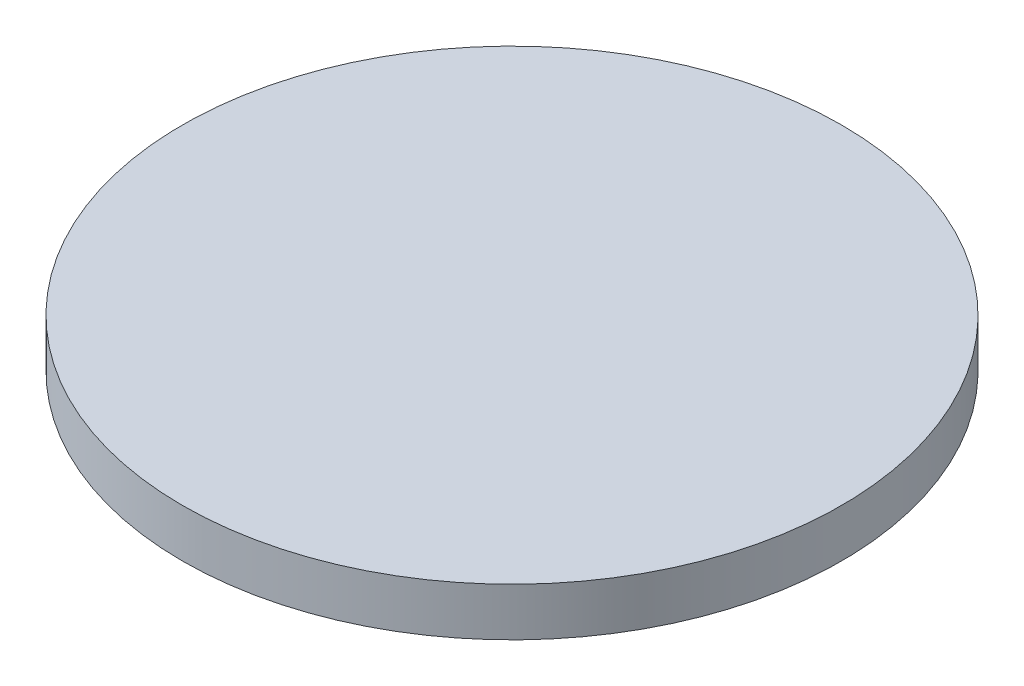
ISO-10303-21;
HEADER;
FILE_DESCRIPTION(('STEP AP214'),'2;1');
FILE_NAME('part.step','',(''),(''),'','','');
FILE_SCHEMA(('AUTOMOTIVE_DESIGN { 1 0 10303 214 1 1 1 1 }'));
ENDSEC;
DATA;
#1=APPLICATION_CONTEXT('core data for automotive mechanical design processes');
#2=APPLICATION_PROTOCOL_DEFINITION('international standard','automotive_design',2000,#1);
#3=PRODUCT_CONTEXT('',#1,'mechanical');
#4=PRODUCT('Part','Part','',(#3));
#5=PRODUCT_RELATED_PRODUCT_CATEGORY('part','',(#4));
#6=PRODUCT_DEFINITION_FORMATION('','',#4);
#7=PRODUCT_DEFINITION_CONTEXT('part definition',#1,'design');
#8=PRODUCT_DEFINITION('design','',#6,#7);
#9=PRODUCT_DEFINITION_SHAPE('','',#8);
#10=(LENGTH_UNIT() NAMED_UNIT(*) SI_UNIT(.MILLI.,.METRE.));
#11=(NAMED_UNIT(*) PLANE_ANGLE_UNIT() SI_UNIT($,.RADIAN.));
#12=(NAMED_UNIT(*) SI_UNIT($,.STERADIAN.) SOLID_ANGLE_UNIT());
#13=UNCERTAINTY_MEASURE_WITH_UNIT(LENGTH_MEASURE(1.E-05),#10,'distance_accuracy_value','');
#14=(GEOMETRIC_REPRESENTATION_CONTEXT(3) GLOBAL_UNCERTAINTY_ASSIGNED_CONTEXT((#13)) GLOBAL_UNIT_ASSIGNED_CONTEXT((#10,
#11,#12)) REPRESENTATION_CONTEXT('',''));
#15=CARTESIAN_POINT('',(0.,0.,0.));
#16=DIRECTION('',(0.,0.,1.));
#17=DIRECTION('',(1.,0.,0.));
#18=AXIS2_PLACEMENT_3D('',#15,#16,#17);
#19=CARTESIAN_POINT('',(0.,10.,0.));
#20=DIRECTION('',(0.,-1.,0.));
#21=DIRECTION('',(0.,0.,-1.));
#22=AXIS2_PLACEMENT_3D('',#19,#20,#21);
#23=CYLINDRICAL_SURFACE('',#22,68.4109695120517);
#24=CARTESIAN_POINT('',(0.,10.,0.));
#25=DIRECTION('',(0.,1.,0.));
#26=DIRECTION('',(0.,0.,1.));
#27=AXIS2_PLACEMENT_3D('',#24,#25,#26);
#28=CIRCLE('',#27,68.4109695120517);
#29=CARTESIAN_POINT('',(0.,10.,68.4109695120517));
#30=VERTEX_POINT('',#29);
#31=EDGE_CURVE('E10',#30,#30,#28,.T.);
#32=ORIENTED_EDGE('',*,*,#31,.F.);
#33=EDGE_LOOP('',(#32));
#34=FACE_BOUND('',#33,.T.);
#35=CARTESIAN_POINT('',(0.,0.,0.));
#36=DIRECTION('',(0.,1.,0.));
#37=DIRECTION('',(0.,0.,1.));
#38=AXIS2_PLACEMENT_3D('',#35,#36,#37);
#39=CIRCLE('',#38,68.4109695120517);
#40=CARTESIAN_POINT('',(0.,0.,68.4109695120517));
#41=VERTEX_POINT('',#40);
#42=EDGE_CURVE('E35',#41,#41,#39,.T.);
#43=ORIENTED_EDGE('',*,*,#42,.T.);
#44=EDGE_LOOP('',(#43));
#45=FACE_BOUND('',#44,.T.);
#46=ADVANCED_FACE('F32',(#34,#45),#23,.T.);
#47=CARTESIAN_POINT('',(0.,10.,0.));
#48=DIRECTION('',(0.,1.,0.));
#49=DIRECTION('',(0.,0.,1.));
#50=AXIS2_PLACEMENT_3D('',#47,#48,#49);
#51=PLANE('',#50);
#52=ORIENTED_EDGE('',*,*,#31,.T.);
#53=EDGE_LOOP('',(#52));
#54=FACE_BOUND('',#53,.T.);
#55=ADVANCED_FACE('F47',(#54),#51,.T.);
#56=CARTESIAN_POINT('',(0.,0.,0.));
#57=DIRECTION('',(0.,1.,0.));
#58=DIRECTION('',(0.,0.,1.));
#59=AXIS2_PLACEMENT_3D('',#56,#57,#58);
#60=PLANE('',#59);
#61=ORIENTED_EDGE('',*,*,#42,.F.);
#62=EDGE_LOOP('',(#61));
#63=FACE_BOUND('',#62,.T.);
#64=ADVANCED_FACE('F45',(#63),#60,.F.);
#65=CLOSED_SHELL('',(#46,#55,#64));
#66=MANIFOLD_SOLID_BREP('B2',#65);
#67=ADVANCED_BREP_SHAPE_REPRESENTATION('',(#18,#66),#14);
#68=SHAPE_DEFINITION_REPRESENTATION(#9,#67);
ENDSEC;
END-ISO-10303-21;
